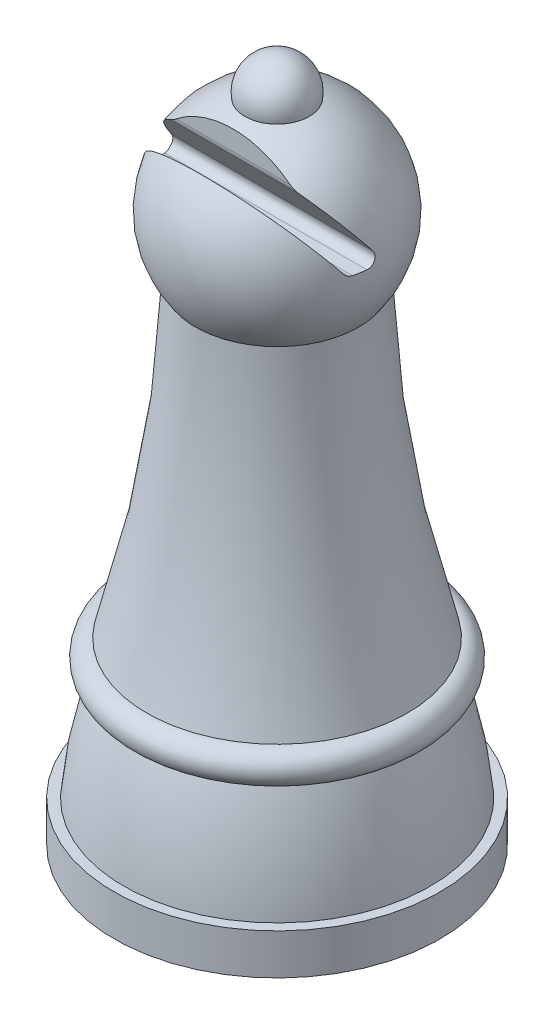
ISO-10303-21;
HEADER;
FILE_DESCRIPTION(('STEP AP214'),'2;1');
FILE_NAME('part.step','',(''),(''),'','','');
FILE_SCHEMA(('AUTOMOTIVE_DESIGN { 1 0 10303 214 1 1 1 1 }'));
ENDSEC;
DATA;
#1=APPLICATION_CONTEXT('core data for automotive mechanical design processes');
#2=APPLICATION_PROTOCOL_DEFINITION('international standard','automotive_design',2000,#1);
#3=PRODUCT_CONTEXT('',#1,'mechanical');
#4=PRODUCT('Part','Part','',(#3));
#5=PRODUCT_RELATED_PRODUCT_CATEGORY('part','',(#4));
#6=PRODUCT_DEFINITION_FORMATION('','',#4);
#7=PRODUCT_DEFINITION_CONTEXT('part definition',#1,'design');
#8=PRODUCT_DEFINITION('design','',#6,#7);
#9=PRODUCT_DEFINITION_SHAPE('','',#8);
#10=(LENGTH_UNIT() NAMED_UNIT(*) SI_UNIT(.MILLI.,.METRE.));
#11=(NAMED_UNIT(*) PLANE_ANGLE_UNIT() SI_UNIT($,.RADIAN.));
#12=(NAMED_UNIT(*) SI_UNIT($,.STERADIAN.) SOLID_ANGLE_UNIT());
#13=UNCERTAINTY_MEASURE_WITH_UNIT(LENGTH_MEASURE(1.E-05),#10,'distance_accuracy_value','');
#14=(GEOMETRIC_REPRESENTATION_CONTEXT(3) GLOBAL_UNCERTAINTY_ASSIGNED_CONTEXT((#13)) GLOBAL_UNIT_ASSIGNED_CONTEXT((#10,
#11,#12)) REPRESENTATION_CONTEXT('',''));
#15=CARTESIAN_POINT('',(0.,0.,0.));
#16=DIRECTION('',(0.,0.,1.));
#17=DIRECTION('',(1.,0.,0.));
#18=AXIS2_PLACEMENT_3D('',#15,#16,#17);
#19=CARTESIAN_POINT('',(0.,42.8625,0.));
#20=DIRECTION('',(0.,-1.,0.));
#21=DIRECTION('',(1.,0.,0.));
#22=AXIS2_PLACEMENT_3D('',#19,#20,#21);
#23=SPHERICAL_SURFACE('',#22,7.9375);
#24=CARTESIAN_POINT('',(0.,50.3936,0.));
#25=DIRECTION('',(0.,-1.,0.));
#26=DIRECTION('',(0.,0.,-1.));
#27=AXIS2_PLACEMENT_3D('',#24,#25,#26);
#28=CIRCLE('',#27,2.50727721642422);
#29=CARTESIAN_POINT('',(0.,50.3936,-2.50727721642422));
#30=VERTEX_POINT('',#29);
#31=EDGE_CURVE('E150',#30,#30,#28,.T.);
#32=ORIENTED_EDGE('',*,*,#31,.T.);
#33=EDGE_LOOP('',(#32));
#34=FACE_BOUND('',#33,.T.);
#35=CARTESIAN_POINT('',(0.,38.1000000000001,0.));
#36=DIRECTION('',(0.,-1.,0.));
#37=DIRECTION('',(0.,0.,-1.));
#38=AXIS2_PLACEMENT_3D('',#35,#36,#37);
#39=CIRCLE('',#38,6.34999999999999);
#40=CARTESIAN_POINT('',(0.,38.1000000000001,-6.34999999999999));
#41=VERTEX_POINT('',#40);
#42=EDGE_CURVE('E174',#41,#41,#39,.T.);
#43=ORIENTED_EDGE('',*,*,#42,.F.);
#44=EDGE_LOOP('',(#43));
#45=FACE_BOUND('',#44,.T.);
#46=CARTESIAN_POINT('',(0.,43.15968,-0.396239999999998));
#47=DIRECTION('',(0.,0.6,-0.8));
#48=DIRECTION('',(0.,0.8,0.6));
#49=AXIS2_PLACEMENT_3D('',#46,#47,#48);
#50=CIRCLE('',#49,7.92203156772302);
#51=CARTESIAN_POINT('',(-4.97664300061353,48.0906666666667,3.302));
#52=VERTEX_POINT('',#51);
#53=CARTESIAN_POINT('',(-7.81540293267085,44.196,0.380999999999994));
#54=VERTEX_POINT('',#53);
#55=EDGE_CURVE('E139',#52,#54,#50,.F.);
#56=ORIENTED_EDGE('',*,*,#55,.F.);
#57=CARTESIAN_POINT('',(-4.97664300061353,48.0906666666667,3.302));
#58=CARTESIAN_POINT('',(-4.94000342654401,48.1143448198711,3.31973369320741));
#59=CARTESIAN_POINT('',(-4.90303294045831,48.1388889869507,3.33558313665292));
#60=CARTESIAN_POINT('',(-4.82866684520529,48.1894524212741,3.36358064045366));
#61=CARTESIAN_POINT('',(-4.79127102288018,48.2154724567741,3.37572675169182));
#62=CARTESIAN_POINT('',(-4.71692612328434,48.2682818048138,3.39620201839259));
#63=CARTESIAN_POINT('',(-4.6799794036611,48.2950522929833,3.40458882445849));
#64=CARTESIAN_POINT('',(-4.60618789674852,48.3495630424478,3.41778047114101));
#65=CARTESIAN_POINT('',(-4.56934305849763,48.3773026561746,3.42258765747951));
#66=CARTESIAN_POINT('',(-4.51849537961279,48.416353169125,3.42668096458725));
#67=CARTESIAN_POINT('',(-4.50433570493832,48.4273110555142,3.42754510423631));
#68=CARTESIAN_POINT('',(-4.47604316640873,48.4493816871116,3.42870527827594));
#69=CARTESIAN_POINT('',(-4.46191052322508,48.4604948081985,3.4289995358243));
#70=CARTESIAN_POINT('',(-4.44782132684703,48.4716666666666,3.42900000000016));
#71=B_SPLINE_CURVE_WITH_KNOTS('',3,(#57,#58,#59,#60,#61,#62,#63,#64,#65,#66,#67,#68,#69,#70),
.UNSPECIFIED.,.F.,.F.,(4,2,2,2,2,2,4),(0.,0.141203762731036,0.282481715256745,0.42151204432427,
0.56045118656132,0.61421962368223,0.668155437856839),.UNSPECIFIED.);
#72=CARTESIAN_POINT('',(-4.44782132684706,48.4716666666667,3.429));
#73=VERTEX_POINT('',#72);
#74=EDGE_CURVE('E81',#52,#73,#71,.T.);
#75=ORIENTED_EDGE('',*,*,#74,.T.);
#76=CARTESIAN_POINT('',(0.,42.8625,3.429));
#77=DIRECTION('',(0.,0.,1.));
#78=DIRECTION('',(1.,0.,0.));
#79=AXIS2_PLACEMENT_3D('',#76,#77,#78);
#80=CIRCLE('',#79,7.15862174234678);
#81=CARTESIAN_POINT('',(4.44782132684706,48.4716666666667,3.429));
#82=VERTEX_POINT('',#81);
#83=EDGE_CURVE('E202',#73,#82,#80,.F.);
#84=ORIENTED_EDGE('',*,*,#83,.T.);
#85=CARTESIAN_POINT('',(4.44782132684706,48.4716666666667,3.429));
#86=CARTESIAN_POINT('',(4.48540736524953,48.4418793501722,3.42897508734301));
#87=CARTESIAN_POINT('',(4.52329149360499,48.412488731604,3.42690380488848));
#88=CARTESIAN_POINT('',(4.59939804382898,48.3546280411556,3.41881148081817));
#89=CARTESIAN_POINT('',(4.63762074698928,48.3261588487829,3.41278677589542));
#90=CARTESIAN_POINT('',(4.71344334967549,48.2707858315614,3.39706231865814));
#91=CARTESIAN_POINT('',(4.75104309229717,48.2438639025066,3.38742500845136));
#92=CARTESIAN_POINT('',(4.8259912070449,48.1913099215309,3.36447958950594));
#93=CARTESIAN_POINT('',(4.86333976049638,48.1656768268355,3.35117450670671));
#94=CARTESIAN_POINT('',(4.91318289264658,48.1322848474091,3.3307913285043));
#95=CARTESIAN_POINT('',(4.92590265903272,48.1238356262562,3.32535705097282));
#96=CARTESIAN_POINT('',(4.95130921427641,48.1071108667939,3.31402536783638));
#97=CARTESIAN_POINT('',(4.96399580420004,48.0988358955368,3.30812667978505));
#98=CARTESIAN_POINT('',(4.97664300061353,48.0906666666666,3.30200000000014));
#99=B_SPLINE_CURVE_WITH_KNOTS('',3,(#85,#86,#87,#88,#89,#90,#91,#92,#93,#94,#95,#96,#97,#98),
.UNSPECIFIED.,.F.,.F.,(4,2,2,2,2,2,4),(0.,0.143812294257845,0.287758035909701,0.429322594148009,
0.570770708321709,0.619390258025804,0.668149124147298),.UNSPECIFIED.);
#100=CARTESIAN_POINT('',(4.97664300061353,48.0906666666667,3.302));
#101=VERTEX_POINT('',#100);
#102=EDGE_CURVE('E209',#82,#101,#99,.T.);
#103=ORIENTED_EDGE('',*,*,#102,.T.);
#104=CARTESIAN_POINT('',(7.81540293267085,44.196,0.380999999999994));
#105=VERTEX_POINT('',#104);
#106=EDGE_CURVE('E154',#105,#101,#50,.F.);
#107=ORIENTED_EDGE('',*,*,#106,.F.);
#108=CARTESIAN_POINT('',(7.81540293267084,44.196,0.380999999999998));
#109=CARTESIAN_POINT('',(7.82136921496203,44.1672243964727,0.359382148905602));
#110=CARTESIAN_POINT('',(7.8272734325118,44.1365745222704,0.340253845721338));
#111=CARTESIAN_POINT('',(7.83879617488126,44.0724544460501,0.307425200265825));
#112=CARTESIAN_POINT('',(7.84441477355441,44.0389849791131,0.293723448545485));
#113=CARTESIAN_POINT('',(7.85521157365956,43.9701151104173,0.272177906115886));
#114=CARTESIAN_POINT('',(7.86038947954891,43.9347134385714,0.264338019552758));
#115=CARTESIAN_POINT('',(7.87015078544651,43.863023036469,0.254787691404602));
#116=CARTESIAN_POINT('',(7.87473438344212,43.8267346064393,0.253075203459404));
#117=CARTESIAN_POINT('',(7.88314169427541,43.75459344237,0.255857769949767));
#118=CARTESIAN_POINT('',(7.88697104701095,43.7187395161153,0.260304584622277));
#119=CARTESIAN_POINT('',(7.89380156933443,43.6482225241688,0.27523373318648));
#120=CARTESIAN_POINT('',(7.8968026607071,43.6135595712147,0.285716636796432));
#121=CARTESIAN_POINT('',(7.90185174166011,43.5469051536441,0.312267748216973));
#122=CARTESIAN_POINT('',(7.90391185251447,43.5148843380982,0.328259979084991));
#123=CARTESIAN_POINT('',(7.90707537445076,43.4539491316658,0.365415890699113));
#124=CARTESIAN_POINT('',(7.90817890713103,43.4250343463563,0.386578913705622));
#125=CARTESIAN_POINT('',(7.90939002969181,43.3714377305859,0.433229386531767));
#126=CARTESIAN_POINT('',(7.90950779687482,43.3467152331279,0.458669872632849));
#127=CARTESIAN_POINT('',(7.90877046344097,43.3018477068603,0.513302027858259));
#128=CARTESIAN_POINT('',(7.90791528913028,43.2817030249285,0.542493980982678));
#129=CARTESIAN_POINT('',(7.90526150794184,43.2466080029567,0.603697967384639));
#130=CARTESIAN_POINT('',(7.90346548329249,43.2316436309768,0.635702083386304));
#131=CARTESIAN_POINT('',(7.89898355587311,43.2072397282043,0.701683402200573));
#132=CARTESIAN_POINT('',(7.89629822804157,43.1977966387576,0.735659318561191));
#133=CARTESIAN_POINT('',(7.89145098393785,43.1874861721321,0.789743692249895));
#134=CARTESIAN_POINT('',(7.88956122811857,43.1846770866934,0.809526902651808));
#135=CARTESIAN_POINT('',(7.88554061675015,43.1809353492034,0.849208310742572));
#136=CARTESIAN_POINT('',(7.88341021586004,43.1799992191427,0.869106226359479));
#137=CARTESIAN_POINT('',(7.8811660939229,43.18,0.888999999999997));
#138=B_SPLINE_CURVE_WITH_KNOTS('',3,(#108,#109,#110,#111,#112,#113,#114,#115,#116,#117,#118,
#119,#120,#121,#122,#123,#124,#125,#126,#127,#128,#129,#130,#131,#132,#133,#134,#135,#136,#137),
.UNSPECIFIED.,.F.,.F.,(4,2,2,2,2,2,2,2,2,2,2,2,2,2,4),(0.,0.10931072833975,0.218593046536166,
0.327948084763844,0.437266598406358,0.545733752014602,0.654211145009725,0.761248784163281,
0.868272814904032,0.974190520842457,1.08011624987626,1.18575276994506,1.29132112842234,
1.35145313170267,1.41147336803804),.UNSPECIFIED.);
#139=CARTESIAN_POINT('',(7.8811660939229,43.18,0.888999999999998));
#140=VERTEX_POINT('',#139);
#141=EDGE_CURVE('E12',#105,#140,#138,.T.);
#142=ORIENTED_EDGE('',*,*,#141,.T.);
#143=CARTESIAN_POINT('',(0.,43.18,0.));
#144=DIRECTION('',(0.,-1.,0.));
#145=DIRECTION('',(0.,0.,-1.));
#146=AXIS2_PLACEMENT_3D('',#143,#144,#145);
#147=CIRCLE('',#146,7.93114745796597);
#148=CARTESIAN_POINT('',(7.71440067341592,43.18,1.8415));
#149=VERTEX_POINT('',#148);
#150=EDGE_CURVE('E128',#149,#140,#147,.F.);
#151=ORIENTED_EDGE('',*,*,#150,.F.);
#152=CARTESIAN_POINT('',(7.71440067341592,43.18,1.8415));
#153=CARTESIAN_POINT('',(7.70556875655462,43.1799737257743,1.87851498915395));
#154=CARTESIAN_POINT('',(7.6963421242462,43.1832340307176,1.91541463674779));
#155=CARTESIAN_POINT('',(7.67737862116881,43.1960308049822,1.98795224099616));
#156=CARTESIAN_POINT('',(7.66764206578911,43.2055634360731,2.02359095520949));
#157=CARTESIAN_POINT('',(7.64792406627559,43.230611572621,2.09263172624479));
#158=CARTESIAN_POINT('',(7.63794256370051,43.2461285191126,2.12603324206966));
#159=CARTESIAN_POINT('',(7.61801942017151,43.2826855532901,2.18965116349397));
#160=CARTESIAN_POINT('',(7.60807775235248,43.3037208878036,2.21987027896017));
#161=CARTESIAN_POINT('',(7.59175388686078,43.3429469623198,2.26693571010485));
#162=CARTESIAN_POINT('',(7.58528152673418,43.3597790020685,2.28490021154999));
#163=CARTESIAN_POINT('',(7.572567116774,43.3954396388538,2.31878299856448));
#164=CARTESIAN_POINT('',(7.56632488588115,43.4142666191002,2.33470291835434));
#165=CARTESIAN_POINT('',(7.56023437136707,43.434,2.3495));
#166=B_SPLINE_CURVE_WITH_KNOTS('',3,(#152,#153,#154,#155,#156,#157,#158,#159,#160,#161,#162,
#163,#164,#165),.UNSPECIFIED.,.F.,.F.,(4,2,2,2,2,2,4),(0.,0.11399247012757,0.227915249528837,
0.341865478897528,0.45571787954254,0.531930288532359,0.608081397226053),.UNSPECIFIED.);
#167=CARTESIAN_POINT('',(7.56023437136707,43.434,2.3495));
#168=VERTEX_POINT('',#167);
#169=EDGE_CURVE('E164',#149,#168,#166,.T.);
#170=ORIENTED_EDGE('',*,*,#169,.T.);
#171=CARTESIAN_POINT('',(0.,41.94048,1.22936000000001));
#172=DIRECTION('',(0.,-0.6,0.8));
#173=DIRECTION('',(0.,-0.8,-0.6));
#174=AXIS2_PLACEMENT_3D('',#171,#172,#173);
#175=CIRCLE('',#174,7.78732684301873);
#176=CARTESIAN_POINT('',(-7.56023437136707,43.434,2.3495));
#177=VERTEX_POINT('',#176);
#178=EDGE_CURVE('E135',#177,#168,#175,.F.);
#179=ORIENTED_EDGE('',*,*,#178,.F.);
#180=CARTESIAN_POINT('',(-7.56023437136707,43.434,2.3495));
#181=CARTESIAN_POINT('',(-7.56937918247346,43.4043506262067,2.32729516237334));
#182=CARTESIAN_POINT('',(-7.57887254021142,43.3767592973268,2.302520769519));
#183=CARTESIAN_POINT('',(-7.59826760410809,43.3263423138459,2.24867240226351));
#184=CARTESIAN_POINT('',(-7.60816916328356,43.3035149614966,2.21959996589698));
#185=CARTESIAN_POINT('',(-7.62810229688549,43.2632464123272,2.15796725625582));
#186=CARTESIAN_POINT('',(-7.63813391545107,43.245807096731,2.12540577011758));
#187=CARTESIAN_POINT('',(-7.65803671410263,43.2168214751917,2.05773816325907));
#188=CARTESIAN_POINT('',(-7.66790804389865,43.2052693227486,2.02263460678525));
#189=CARTESIAN_POINT('',(-7.68394284431474,43.1912602580685,1.96302872080204));
#190=CARTESIAN_POINT('',(-7.69023076476453,43.1870484583053,1.93895826772137));
#191=CARTESIAN_POINT('',(-7.70253570201554,43.1814181165862,1.89044329287128));
#192=CARTESIAN_POINT('',(-7.70855290526362,43.1799976225261,1.86599904458171));
#193=CARTESIAN_POINT('',(-7.71440067341592,43.18,1.8415));
#194=B_SPLINE_CURVE_WITH_KNOTS('',3,(#180,#181,#182,#183,#184,#185,#186,#187,#188,#189,#190,
#191,#192,#193),.UNSPECIFIED.,.F.,.F.,(4,2,2,2,2,2,4),(0.,0.114298061726082,0.228555320989374,
0.342852428015183,0.457035805111647,0.532584185638572,0.608079712453039),.UNSPECIFIED.);
#195=CARTESIAN_POINT('',(-7.71440067341592,43.18,1.8415));
#196=VERTEX_POINT('',#195);
#197=EDGE_CURVE('E119',#177,#196,#194,.T.);
#198=ORIENTED_EDGE('',*,*,#197,.T.);
#199=CARTESIAN_POINT('',(-7.8811660939229,43.18,0.888999999999998));
#200=VERTEX_POINT('',#199);
#201=EDGE_CURVE('E125',#200,#196,#147,.F.);
#202=ORIENTED_EDGE('',*,*,#201,.F.);
#203=CARTESIAN_POINT('',(-7.8811660939229,43.18,0.888999999999998));
#204=CARTESIAN_POINT('',(-7.88515702271519,43.1799688347744,0.853652496307351));
#205=CARTESIAN_POINT('',(-7.8887853359885,43.1829498967979,0.818266304978347));
#206=CARTESIAN_POINT('',(-7.89522866568872,43.1947536486072,0.748419714893214));
#207=CARTESIAN_POINT('',(-7.89804399516043,43.2035740855838,0.713958964438433));
#208=CARTESIAN_POINT('',(-7.9027782826602,43.2268827788342,0.646912433554881));
#209=CARTESIAN_POINT('',(-7.90469656484852,43.2413752934273,0.614328082968516));
#210=CARTESIAN_POINT('',(-7.90757727818418,43.2756195361701,0.552018836175224));
#211=CARTESIAN_POINT('',(-7.90854003442946,43.2953694726886,0.522292970538665));
#212=CARTESIAN_POINT('',(-7.90947839656738,43.3394219453701,0.466745728525816));
#213=CARTESIAN_POINT('',(-7.9094607021518,43.3636924542483,0.440899062667265));
#214=CARTESIAN_POINT('',(-7.90845536079933,43.4161836928193,0.3936024292873));
#215=CARTESIAN_POINT('',(-7.90746756305388,43.4444050361086,0.372153145992826));
#216=CARTESIAN_POINT('',(-7.90455465268655,43.5039087644783,0.334304072458813));
#217=CARTESIAN_POINT('',(-7.90263185456021,43.5351834393626,0.317891975979404));
#218=CARTESIAN_POINT('',(-7.89790620581652,43.5999575726422,0.290486468987528));
#219=CARTESIAN_POINT('',(-7.89510339390237,43.6334569331443,0.279492820225219));
#220=CARTESIAN_POINT('',(-7.8886787827083,43.7019421902506,0.263148783014622));
#221=CARTESIAN_POINT('',(-7.88505217796817,43.7369357896478,0.257832594289058));
#222=CARTESIAN_POINT('',(-7.87709201997068,43.8072435334968,0.253070404119699));
#223=CARTESIAN_POINT('',(-7.87275836666873,43.8425577226422,0.25362523411264));
#224=CARTESIAN_POINT('',(-7.86344933374559,43.9129528552077,0.260591838549908));
#225=CARTESIAN_POINT('',(-7.85846682220648,43.9480258029245,0.267074417330788));
#226=CARTESIAN_POINT('',(-7.84804083557335,44.0165257803863,0.285782636109984));
#227=CARTESIAN_POINT('',(-7.84259758772419,44.0499536088204,0.298005458274669));
#228=CARTESIAN_POINT('',(-7.83349514767199,44.1022292106797,0.322238728588023));
#229=CARTESIAN_POINT('',(-7.82992821769879,44.1218627380999,0.332626273439012));
#230=CARTESIAN_POINT('',(-7.82271651400604,44.1598935297424,0.355367411031329));
#231=CARTESIAN_POINT('',(-7.81907188571033,44.1782928749583,0.367717569673977));
#232=CARTESIAN_POINT('',(-7.81540293267084,44.196,0.380999999999997));
#233=B_SPLINE_CURVE_WITH_KNOTS('',3,(#203,#204,#205,#206,#207,#208,#209,#210,#211,#212,#213,
#214,#215,#216,#217,#218,#219,#220,#221,#222,#223,#224,#225,#226,#227,#228,#229,#230,#231,#232),
.UNSPECIFIED.,.F.,.F.,(4,2,2,2,2,2,2,2,2,2,2,2,2,2,4),(0.,0.106586750332596,0.213132403837508,
0.319758200534698,0.426347707561206,0.532208949287057,0.638086650402025,0.743703586352171,
0.84931587789767,0.955560826209845,1.06182082082646,1.1693668621701,1.27686016522832,
1.34423952363091,1.41150225694811),.UNSPECIFIED.);
#234=EDGE_CURVE('E68',#200,#54,#233,.T.);
#235=ORIENTED_EDGE('',*,*,#234,.T.);
#236=EDGE_LOOP('',(#56,#75,#84,#103,#107,#142,#151,#170,#179,#198,#202,#235));
#237=FACE_BOUND('',#236,.T.);
#238=ADVANCED_FACE('F53',(#34,#45,#237),#23,.T.);
#239=CARTESIAN_POINT('',(0.,0.,0.));
#240=DIRECTION('',(0.,-1.,0.));
#241=DIRECTION('',(0.,0.,-1.));
#242=AXIS2_PLACEMENT_3D('',#239,#240,#241);
#243=PLANE('',#242);
#244=CARTESIAN_POINT('',(0.,0.,0.));
#245=DIRECTION('',(0.,-1.,0.));
#246=DIRECTION('',(0.,0.,-1.));
#247=AXIS2_PLACEMENT_3D('',#244,#245,#246);
#248=CIRCLE('',#247,12.7);
#249=CARTESIAN_POINT('',(0.,0.,-12.7));
#250=VERTEX_POINT('',#249);
#251=EDGE_CURVE('E198',#250,#250,#248,.T.);
#252=ORIENTED_EDGE('',*,*,#251,.T.);
#253=EDGE_LOOP('',(#252));
#254=FACE_BOUND('',#253,.T.);
#255=ADVANCED_FACE('F235',(#254),#243,.T.);
#256=CARTESIAN_POINT('',(0.,50.8,0.));
#257=DIRECTION('',(0.,-1.,0.));
#258=DIRECTION('',(1.,0.,0.));
#259=AXIS2_PLACEMENT_3D('',#256,#257,#258);
#260=SPHERICAL_SURFACE('',#259,2.54);
#261=ORIENTED_EDGE('',*,*,#31,.F.);
#262=EDGE_LOOP('',(#261));
#263=FACE_BOUND('',#262,.T.);
#264=ADVANCED_FACE('F273',(#263),#260,.T.);
#265=CARTESIAN_POINT('',(0.,41.3667558760647,0.));
#266=DIRECTION('',(0.,-1.,0.));
#267=DIRECTION('',(0.,0.,-1.));
#268=AXIS2_PLACEMENT_3D('',#265,#266,#267);
#269=TOROIDAL_SURFACE('',#268,105.35612054841,99.06);
#270=ORIENTED_EDGE('',*,*,#42,.T.);
#271=EDGE_LOOP('',(#270));
#272=FACE_BOUND('',#271,.T.);
#273=CARTESIAN_POINT('',(0.,13.97,0.));
#274=DIRECTION('',(0.,-1.,0.));
#275=DIRECTION('',(0.,0.,-1.));
#276=AXIS2_PLACEMENT_3D('',#273,#274,#275);
#277=CIRCLE('',#276,10.16);
#278=CARTESIAN_POINT('',(0.,13.97,-10.16));
#279=VERTEX_POINT('',#278);
#280=EDGE_CURVE('E179',#279,#279,#277,.T.);
#281=ORIENTED_EDGE('',*,*,#280,.F.);
#282=EDGE_LOOP('',(#281));
#283=FACE_BOUND('',#282,.T.);
#284=ADVANCED_FACE('F279',(#272,#283),#269,.F.);
#285=CARTESIAN_POINT('',(0.,12.7,0.));
#286=DIRECTION('',(0.,-1.,0.));
#287=DIRECTION('',(0.,0.,-1.));
#288=AXIS2_PLACEMENT_3D('',#285,#286,#287);
#289=TOROIDAL_SURFACE('',#288,10.16,1.27);
#290=ORIENTED_EDGE('',*,*,#280,.T.);
#291=EDGE_LOOP('',(#290));
#292=FACE_BOUND('',#291,.T.);
#293=CARTESIAN_POINT('',(0.,11.43,0.));
#294=DIRECTION('',(0.,-1.,0.));
#295=DIRECTION('',(0.,0.,-1.));
#296=AXIS2_PLACEMENT_3D('',#293,#294,#295);
#297=CIRCLE('',#296,10.16);
#298=CARTESIAN_POINT('',(0.,11.43,-10.16));
#299=VERTEX_POINT('',#298);
#300=EDGE_CURVE('E184',#299,#299,#297,.T.);
#301=ORIENTED_EDGE('',*,*,#300,.F.);
#302=EDGE_LOOP('',(#301));
#303=FACE_BOUND('',#302,.T.);
#304=ADVANCED_FACE('F297',(#292,#303),#289,.T.);
#305=CARTESIAN_POINT('',(0.,0.676718395339822,0.));
#306=DIRECTION('',(0.,-1.,0.));
#307=DIRECTION('',(0.,0.,-1.));
#308=AXIS2_PLACEMENT_3D('',#305,#306,#307);
#309=DEGENERATE_TOROIDAL_SURFACE('',#308,19.713557450208,31.75,.F.);
#310=ORIENTED_EDGE('',*,*,#300,.T.);
#311=EDGE_LOOP('',(#310));
#312=FACE_BOUND('',#311,.T.);
#313=CARTESIAN_POINT('',(0.,3.175,0.));
#314=DIRECTION('',(0.,-1.,0.));
#315=DIRECTION('',(0.,0.,-1.));
#316=AXIS2_PLACEMENT_3D('',#313,#314,#315);
#317=CIRCLE('',#316,11.938);
#318=CARTESIAN_POINT('',(0.,3.175,-11.938));
#319=VERTEX_POINT('',#318);
#320=EDGE_CURVE('E190',#319,#319,#317,.T.);
#321=ORIENTED_EDGE('',*,*,#320,.F.);
#322=EDGE_LOOP('',(#321));
#323=FACE_BOUND('',#322,.T.);
#324=ADVANCED_FACE('F291',(#312,#323),#309,.F.);
#325=CARTESIAN_POINT('',(12.7,3.175,0.));
#326=DIRECTION('',(0.,1.,0.));
#327=DIRECTION('',(0.,0.,1.));
#328=AXIS2_PLACEMENT_3D('',#325,#326,#327);
#329=PLANE('',#328);
#330=ORIENTED_EDGE('',*,*,#320,.T.);
#331=EDGE_LOOP('',(#330));
#332=FACE_BOUND('',#331,.T.);
#333=CARTESIAN_POINT('',(0.,3.175,0.));
#334=DIRECTION('',(0.,-1.,0.));
#335=DIRECTION('',(0.,0.,-1.));
#336=AXIS2_PLACEMENT_3D('',#333,#334,#335);
#337=CIRCLE('',#336,12.7);
#338=CARTESIAN_POINT('',(0.,3.175,-12.7));
#339=VERTEX_POINT('',#338);
#340=EDGE_CURVE('E194',#339,#339,#337,.T.);
#341=ORIENTED_EDGE('',*,*,#340,.F.);
#342=EDGE_LOOP('',(#341));
#343=FACE_BOUND('',#342,.T.);
#344=ADVANCED_FACE('F284',(#332,#343),#329,.T.);
#345=CARTESIAN_POINT('',(0.,0.,0.));
#346=DIRECTION('',(0.,-1.,0.));
#347=DIRECTION('',(0.,0.,-1.));
#348=AXIS2_PLACEMENT_3D('',#345,#346,#347);
#349=CYLINDRICAL_SURFACE('',#348,12.7);
#350=ORIENTED_EDGE('',*,*,#340,.T.);
#351=EDGE_LOOP('',(#350));
#352=FACE_BOUND('',#351,.T.);
#353=ORIENTED_EDGE('',*,*,#251,.F.);
#354=EDGE_LOOP('',(#353));
#355=FACE_BOUND('',#354,.T.);
#356=ADVANCED_FACE('F283',(#352,#355),#349,.T.);
#357=CARTESIAN_POINT('',(0.,43.18,0.));
#358=DIRECTION('',(0.,-1.,0.));
#359=DIRECTION('',(0.,0.,-1.));
#360=AXIS2_PLACEMENT_3D('',#357,#358,#359);
#361=PLANE('',#360);
#362=ORIENTED_EDGE('',*,*,#201,.T.);
#363=DIRECTION('',(1.,0.,0.));
#364=VECTOR('',#363,1.);
#365=CARTESIAN_POINT('',(7.6316327872874,43.18,1.8415));
#366=LINE('',#365,#364);
#367=EDGE_CURVE('E130',#196,#149,#366,.T.);
#368=ORIENTED_EDGE('',*,*,#367,.T.);
#369=ORIENTED_EDGE('',*,*,#150,.T.);
#370=DIRECTION('',(-1.,0.,0.));
#371=VECTOR('',#370,1.);
#372=CARTESIAN_POINT('',(-7.92199084826535,43.18,0.888999999999998));
#373=LINE('',#372,#371);
#374=EDGE_CURVE('E114',#140,#200,#373,.T.);
#375=ORIENTED_EDGE('',*,*,#374,.T.);
#376=EDGE_LOOP('',(#362,#368,#369,#375));
#377=FACE_BOUND('',#376,.T.);
#378=ADVANCED_FACE('F123',(#377),#361,.F.);
#379=CARTESIAN_POINT('',(0.,14.50848,-19.34464));
#380=DIRECTION('',(0.,-0.6,0.8));
#381=DIRECTION('',(0.,-0.8,-0.6));
#382=AXIS2_PLACEMENT_3D('',#379,#380,#381);
#383=PLANE('',#382);
#384=ORIENTED_EDGE('',*,*,#178,.T.);
#385=DIRECTION('',(1.,0.,0.));
#386=VECTOR('',#385,1.);
#387=CARTESIAN_POINT('',(-7.6316327872874,43.434,2.3495));
#388=LINE('',#387,#386);
#389=EDGE_CURVE('E159',#168,#177,#388,.F.);
#390=ORIENTED_EDGE('',*,*,#389,.T.);
#391=EDGE_LOOP('',(#384,#390));
#392=FACE_BOUND('',#391,.T.);
#393=ADVANCED_FACE('F264',(#392),#383,.F.);
#394=CARTESIAN_POINT('',(0.,15.72768,-20.97024));
#395=DIRECTION('',(0.,0.6,-0.8));
#396=DIRECTION('',(0.,0.8,0.6));
#397=AXIS2_PLACEMENT_3D('',#394,#395,#396);
#398=PLANE('',#397);
#399=ORIENTED_EDGE('',*,*,#106,.T.);
#400=DIRECTION('',(-1.,0.,0.));
#401=VECTOR('',#400,1.);
#402=CARTESIAN_POINT('',(-4.70243117971972,48.0906666666667,3.302));
#403=LINE('',#402,#401);
#404=EDGE_CURVE('E208',#101,#52,#403,.T.);
#405=ORIENTED_EDGE('',*,*,#404,.T.);
#406=ORIENTED_EDGE('',*,*,#55,.T.);
#407=DIRECTION('',(-1.,0.,0.));
#408=VECTOR('',#407,1.);
#409=CARTESIAN_POINT('',(7.92199084826536,44.196,0.380999999999995));
#410=LINE('',#409,#408);
#411=EDGE_CURVE('E115',#54,#105,#410,.F.);
#412=ORIENTED_EDGE('',*,*,#411,.T.);
#413=EDGE_LOOP('',(#399,#405,#406,#412));
#414=FACE_BOUND('',#413,.T.);
#415=ADVANCED_FACE('F257',(#414),#398,.F.);
#416=CARTESIAN_POINT('',(-8.89,59.055,3.429));
#417=DIRECTION('',(0.,0.,1.));
#418=DIRECTION('',(1.,0.,0.));
#419=AXIS2_PLACEMENT_3D('',#416,#417,#418);
#420=PLANE('',#419);
#421=ORIENTED_EDGE('',*,*,#83,.F.);
#422=DIRECTION('',(-1.,0.,0.));
#423=VECTOR('',#422,1.);
#424=CARTESIAN_POINT('',(4.70243117971971,48.4716666666667,3.429));
#425=LINE('',#424,#423);
#426=EDGE_CURVE('E74',#73,#82,#425,.F.);
#427=ORIENTED_EDGE('',*,*,#426,.T.);
#428=EDGE_LOOP('',(#421,#427));
#429=FACE_BOUND('',#428,.T.);
#430=ADVANCED_FACE('F234',(#429),#420,.T.);
#431=CARTESIAN_POINT('',(0.,43.815,1.8415));
#432=DIRECTION('',(-1.,0.,0.));
#433=DIRECTION('',(0.,0.,1.));
#434=AXIS2_PLACEMENT_3D('',#431,#432,#433);
#435=CYLINDRICAL_SURFACE('',#434,0.635);
#436=ORIENTED_EDGE('',*,*,#197,.F.);
#437=ORIENTED_EDGE('',*,*,#389,.F.);
#438=ORIENTED_EDGE('',*,*,#169,.F.);
#439=ORIENTED_EDGE('',*,*,#367,.F.);
#440=EDGE_LOOP('',(#436,#437,#438,#439));
#441=FACE_BOUND('',#440,.T.);
#442=ADVANCED_FACE('F228',(#441),#435,.F.);
#443=CARTESIAN_POINT('',(0.,48.4716666666667,2.794));
#444=DIRECTION('',(1.,0.,0.));
#445=DIRECTION('',(0.,0.,-1.));
#446=AXIS2_PLACEMENT_3D('',#443,#444,#445);
#447=CYLINDRICAL_SURFACE('',#446,0.635);
#448=ORIENTED_EDGE('',*,*,#102,.F.);
#449=ORIENTED_EDGE('',*,*,#426,.F.);
#450=ORIENTED_EDGE('',*,*,#74,.F.);
#451=ORIENTED_EDGE('',*,*,#404,.F.);
#452=EDGE_LOOP('',(#448,#449,#450,#451));
#453=FACE_BOUND('',#452,.T.);
#454=ADVANCED_FACE('F224',(#453),#447,.T.);
#455=CARTESIAN_POINT('',(0.,43.815,0.888999999999998));
#456=DIRECTION('',(1.,0.,0.));
#457=DIRECTION('',(0.,0.,-1.));
#458=AXIS2_PLACEMENT_3D('',#455,#456,#457);
#459=CYLINDRICAL_SURFACE('',#458,0.635);
#460=ORIENTED_EDGE('',*,*,#141,.F.);
#461=ORIENTED_EDGE('',*,*,#411,.F.);
#462=ORIENTED_EDGE('',*,*,#234,.F.);
#463=ORIENTED_EDGE('',*,*,#374,.F.);
#464=EDGE_LOOP('',(#460,#461,#462,#463));
#465=FACE_BOUND('',#464,.T.);
#466=ADVANCED_FACE('F55',(#465),#459,.F.);
#467=CLOSED_SHELL('',(#238,#255,#264,#284,#304,#324,#344,#356,#378,#393,#415,#430,#442,#454,#466));
#468=MANIFOLD_SOLID_BREP('B2',#467);
#469=ADVANCED_BREP_SHAPE_REPRESENTATION('',(#18,#468),#14);
#470=SHAPE_DEFINITION_REPRESENTATION(#9,#469);
ENDSEC;
END-ISO-10303-21;
